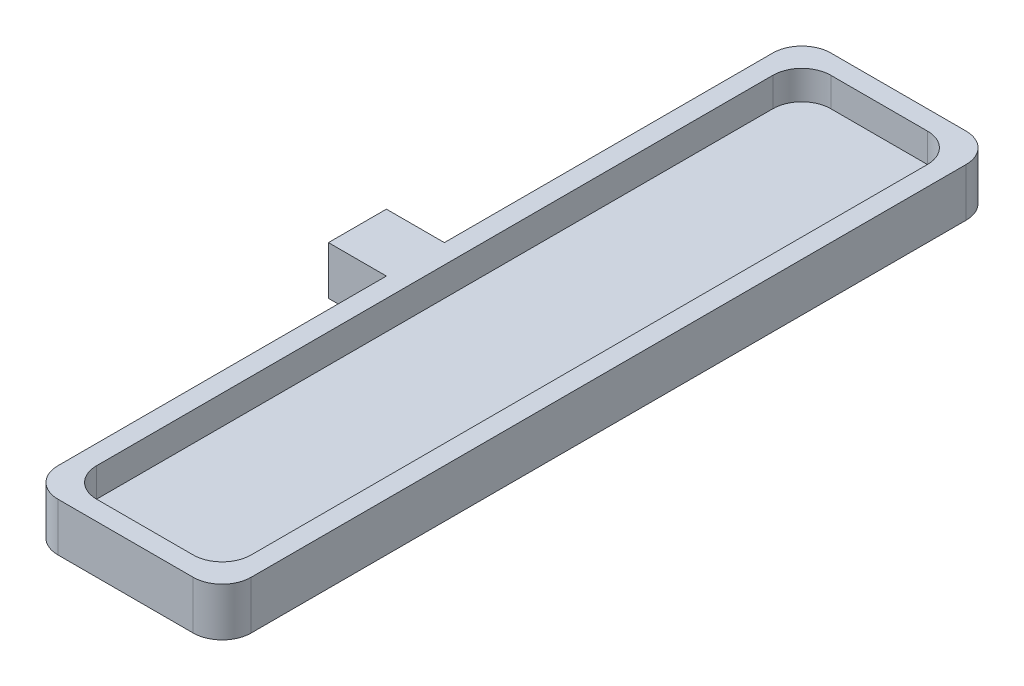
ISO-10303-21;
HEADER;
FILE_DESCRIPTION(('STEP AP214'),'2;1');
FILE_NAME('part.step','',(''),(''),'','','');
FILE_SCHEMA(('AUTOMOTIVE_DESIGN { 1 0 10303 214 1 1 1 1 }'));
ENDSEC;
DATA;
#1=APPLICATION_CONTEXT('core data for automotive mechanical design processes');
#2=APPLICATION_PROTOCOL_DEFINITION('international standard','automotive_design',2000,#1);
#3=PRODUCT_CONTEXT('',#1,'mechanical');
#4=PRODUCT('Part','Part','',(#3));
#5=PRODUCT_RELATED_PRODUCT_CATEGORY('part','',(#4));
#6=PRODUCT_DEFINITION_FORMATION('','',#4);
#7=PRODUCT_DEFINITION_CONTEXT('part definition',#1,'design');
#8=PRODUCT_DEFINITION('design','',#6,#7);
#9=PRODUCT_DEFINITION_SHAPE('','',#8);
#10=(LENGTH_UNIT() NAMED_UNIT(*) SI_UNIT(.MILLI.,.METRE.));
#11=(NAMED_UNIT(*) PLANE_ANGLE_UNIT() SI_UNIT($,.RADIAN.));
#12=(NAMED_UNIT(*) SI_UNIT($,.STERADIAN.) SOLID_ANGLE_UNIT());
#13=UNCERTAINTY_MEASURE_WITH_UNIT(LENGTH_MEASURE(1.E-05),#10,'distance_accuracy_value','');
#14=(GEOMETRIC_REPRESENTATION_CONTEXT(3) GLOBAL_UNCERTAINTY_ASSIGNED_CONTEXT((#13)) GLOBAL_UNIT_ASSIGNED_CONTEXT((#10,
#11,#12)) REPRESENTATION_CONTEXT('',''));
#15=CARTESIAN_POINT('',(0.,0.,0.));
#16=DIRECTION('',(0.,0.,1.));
#17=DIRECTION('',(1.,0.,0.));
#18=AXIS2_PLACEMENT_3D('',#15,#16,#17);
#19=CARTESIAN_POINT('',(0.,5.,0.));
#20=DIRECTION('',(1.,0.,0.));
#21=DIRECTION('',(0.,0.,-1.));
#22=AXIS2_PLACEMENT_3D('',#19,#20,#21);
#23=PLANE('',#22);
#24=DIRECTION('',(0.,1.,0.));
#25=VECTOR('',#24,1.);
#26=CARTESIAN_POINT('',(0.,0.,-37.));
#27=LINE('',#26,#25);
#28=CARTESIAN_POINT('',(0.,0.,-37.));
#29=VERTEX_POINT('',#28);
#30=CARTESIAN_POINT('',(0.,5.,-37.));
#31=VERTEX_POINT('',#30);
#32=EDGE_CURVE('E203',#29,#31,#27,.T.);
#33=ORIENTED_EDGE('',*,*,#32,.F.);
#34=DIRECTION('',(0.,0.,1.));
#35=VECTOR('',#34,1.);
#36=CARTESIAN_POINT('',(0.,0.,0.));
#37=LINE('',#36,#35);
#38=CARTESIAN_POINT('',(0.,0.,-3.));
#39=VERTEX_POINT('',#38);
#40=EDGE_CURVE('E239',#29,#39,#37,.T.);
#41=ORIENTED_EDGE('',*,*,#40,.T.);
#42=DIRECTION('',(0.,-1.,0.));
#43=VECTOR('',#42,1.);
#44=CARTESIAN_POINT('',(0.,5.,-3.));
#45=LINE('',#44,#43);
#46=CARTESIAN_POINT('',(0.,5.,-3.));
#47=VERTEX_POINT('',#46);
#48=EDGE_CURVE('E290',#39,#47,#45,.F.);
#49=ORIENTED_EDGE('',*,*,#48,.T.);
#50=DIRECTION('',(0.,0.,1.));
#51=VECTOR('',#50,1.);
#52=CARTESIAN_POINT('',(0.,5.,0.));
#53=LINE('',#52,#51);
#54=EDGE_CURVE('E55',#31,#47,#53,.T.);
#55=ORIENTED_EDGE('',*,*,#54,.F.);
#56=EDGE_LOOP('',(#33,#41,#49,#55));
#57=FACE_BOUND('',#56,.T.);
#58=ADVANCED_FACE('F39',(#57),#23,.F.);
#59=DIRECTION('',(0.,-1.,0.));
#60=VECTOR('',#59,1.);
#61=CARTESIAN_POINT('',(0.,0.,-43.));
#62=LINE('',#61,#60);
#63=CARTESIAN_POINT('',(0.,5.,-43.));
#64=VERTEX_POINT('',#63);
#65=CARTESIAN_POINT('',(0.,0.,-43.));
#66=VERTEX_POINT('',#65);
#67=EDGE_CURVE('E63',#64,#66,#62,.T.);
#68=ORIENTED_EDGE('',*,*,#67,.F.);
#69=CARTESIAN_POINT('',(0.,5.,-77.));
#70=VERTEX_POINT('',#69);
#71=EDGE_CURVE('E240',#70,#64,#53,.T.);
#72=ORIENTED_EDGE('',*,*,#71,.F.);
#73=DIRECTION('',(0.,-1.,0.));
#74=VECTOR('',#73,1.);
#75=CARTESIAN_POINT('',(0.,5.,-77.));
#76=LINE('',#75,#74);
#77=CARTESIAN_POINT('',(0.,0.,-77.));
#78=VERTEX_POINT('',#77);
#79=EDGE_CURVE('E309',#70,#78,#76,.T.);
#80=ORIENTED_EDGE('',*,*,#79,.T.);
#81=EDGE_CURVE('E254',#78,#66,#37,.T.);
#82=ORIENTED_EDGE('',*,*,#81,.T.);
#83=EDGE_LOOP('',(#68,#72,#80,#82));
#84=FACE_BOUND('',#83,.T.);
#85=ADVANCED_FACE('F416',(#84),#23,.F.);
#86=CARTESIAN_POINT('',(0.,5.,0.));
#87=DIRECTION('',(0.,-1.,0.));
#88=DIRECTION('',(0.,0.,-1.));
#89=AXIS2_PLACEMENT_3D('',#86,#87,#88);
#90=PLANE('',#89);
#91=DIRECTION('',(-1.,0.,0.));
#92=VECTOR('',#91,1.);
#93=CARTESIAN_POINT('',(0.,5.,-80.));
#94=LINE('',#93,#92);
#95=CARTESIAN_POINT('',(17.,5.,-80.));
#96=VERTEX_POINT('',#95);
#97=CARTESIAN_POINT('',(3.,5.,-80.));
#98=VERTEX_POINT('',#97);
#99=EDGE_CURVE('E250',#96,#98,#94,.T.);
#100=ORIENTED_EDGE('',*,*,#99,.T.);
#101=CARTESIAN_POINT('',(3.,5.,-77.));
#102=DIRECTION('',(0.,-1.,0.));
#103=DIRECTION('',(0.,0.,-1.));
#104=AXIS2_PLACEMENT_3D('',#101,#102,#103);
#105=CIRCLE('',#104,3.);
#106=EDGE_CURVE('E319',#98,#70,#105,.F.);
#107=ORIENTED_EDGE('',*,*,#106,.T.);
#108=ORIENTED_EDGE('',*,*,#71,.T.);
#109=DIRECTION('',(1.,0.,0.));
#110=VECTOR('',#109,1.);
#111=CARTESIAN_POINT('',(-6.,5.,-43.));
#112=LINE('',#111,#110);
#113=CARTESIAN_POINT('',(-6.,5.,-43.));
#114=VERTEX_POINT('',#113);
#115=EDGE_CURVE('E186',#114,#64,#112,.T.);
#116=ORIENTED_EDGE('',*,*,#115,.F.);
#117=DIRECTION('',(0.,0.,-1.));
#118=VECTOR('',#117,1.);
#119=CARTESIAN_POINT('',(-6.,5.,-43.));
#120=LINE('',#119,#118);
#121=CARTESIAN_POINT('',(-6.,5.,-37.));
#122=VERTEX_POINT('',#121);
#123=EDGE_CURVE('E177',#122,#114,#120,.T.);
#124=ORIENTED_EDGE('',*,*,#123,.F.);
#125=DIRECTION('',(1.,0.,0.));
#126=VECTOR('',#125,1.);
#127=CARTESIAN_POINT('',(-6.,5.,-37.));
#128=LINE('',#127,#126);
#129=EDGE_CURVE('E183',#122,#31,#128,.T.);
#130=ORIENTED_EDGE('',*,*,#129,.T.);
#131=ORIENTED_EDGE('',*,*,#54,.T.);
#132=CARTESIAN_POINT('',(3.,5.,-3.));
#133=DIRECTION('',(0.,-1.,0.));
#134=DIRECTION('',(0.,0.,-1.));
#135=AXIS2_PLACEMENT_3D('',#132,#133,#134);
#136=CIRCLE('',#135,3.);
#137=CARTESIAN_POINT('',(3.,5.,0.));
#138=VERTEX_POINT('',#137);
#139=EDGE_CURVE('E293',#47,#138,#136,.F.);
#140=ORIENTED_EDGE('',*,*,#139,.T.);
#141=DIRECTION('',(1.,0.,0.));
#142=VECTOR('',#141,1.);
#143=CARTESIAN_POINT('',(0.,5.,0.));
#144=LINE('',#143,#142);
#145=CARTESIAN_POINT('',(17.,5.,0.));
#146=VERTEX_POINT('',#145);
#147=EDGE_CURVE('E243',#138,#146,#144,.T.);
#148=ORIENTED_EDGE('',*,*,#147,.T.);
#149=CARTESIAN_POINT('',(17.,5.,-3.));
#150=DIRECTION('',(0.,-1.,0.));
#151=DIRECTION('',(0.,0.,-1.));
#152=AXIS2_PLACEMENT_3D('',#149,#150,#151);
#153=CIRCLE('',#152,3.);
#154=CARTESIAN_POINT('',(20.,5.,-3.));
#155=VERTEX_POINT('',#154);
#156=EDGE_CURVE('E279',#146,#155,#153,.F.);
#157=ORIENTED_EDGE('',*,*,#156,.T.);
#158=DIRECTION('',(0.,0.,-1.));
#159=VECTOR('',#158,1.);
#160=CARTESIAN_POINT('',(20.,5.,0.));
#161=LINE('',#160,#159);
#162=CARTESIAN_POINT('',(20.,5.,-77.));
#163=VERTEX_POINT('',#162);
#164=EDGE_CURVE('E246',#155,#163,#161,.T.);
#165=ORIENTED_EDGE('',*,*,#164,.T.);
#166=CARTESIAN_POINT('',(17.,5.,-77.));
#167=DIRECTION('',(0.,-1.,0.));
#168=DIRECTION('',(0.,0.,-1.));
#169=AXIS2_PLACEMENT_3D('',#166,#167,#168);
#170=CIRCLE('',#169,3.);
#171=EDGE_CURVE('E306',#163,#96,#170,.F.);
#172=ORIENTED_EDGE('',*,*,#171,.T.);
#173=EDGE_LOOP('',(#100,#107,#108,#116,#124,#130,#131,#140,#148,#157,#165,#172));
#174=FACE_BOUND('',#173,.T.);
#175=DIRECTION('',(0.,0.,1.));
#176=VECTOR('',#175,1.);
#177=CARTESIAN_POINT('',(2.,5.,0.));
#178=LINE('',#177,#176);
#179=CARTESIAN_POINT('',(2.,5.,-75.));
#180=VERTEX_POINT('',#179);
#181=CARTESIAN_POINT('',(2.,5.,-5.));
#182=VERTEX_POINT('',#181);
#183=EDGE_CURVE('E225',#180,#182,#178,.T.);
#184=ORIENTED_EDGE('',*,*,#183,.F.);
#185=CARTESIAN_POINT('',(5.,5.,-75.));
#186=DIRECTION('',(0.,-1.,0.));
#187=DIRECTION('',(0.,0.,-1.));
#188=AXIS2_PLACEMENT_3D('',#185,#186,#187);
#189=CIRCLE('',#188,3.);
#190=CARTESIAN_POINT('',(5.,5.,-78.));
#191=VERTEX_POINT('',#190);
#192=EDGE_CURVE('E359',#180,#191,#189,.T.);
#193=ORIENTED_EDGE('',*,*,#192,.T.);
#194=DIRECTION('',(-1.,0.,0.));
#195=VECTOR('',#194,1.);
#196=CARTESIAN_POINT('',(0.,5.,-78.));
#197=LINE('',#196,#195);
#198=CARTESIAN_POINT('',(15.,5.,-78.));
#199=VERTEX_POINT('',#198);
#200=EDGE_CURVE('E236',#199,#191,#197,.T.);
#201=ORIENTED_EDGE('',*,*,#200,.F.);
#202=CARTESIAN_POINT('',(15.,5.,-75.));
#203=DIRECTION('',(0.,-1.,0.));
#204=DIRECTION('',(0.,0.,-1.));
#205=AXIS2_PLACEMENT_3D('',#202,#203,#204);
#206=CIRCLE('',#205,3.);
#207=CARTESIAN_POINT('',(18.,5.,-75.));
#208=VERTEX_POINT('',#207);
#209=EDGE_CURVE('E11',#199,#208,#206,.T.);
#210=ORIENTED_EDGE('',*,*,#209,.T.);
#211=DIRECTION('',(0.,0.,-1.));
#212=VECTOR('',#211,1.);
#213=CARTESIAN_POINT('',(18.,5.,0.));
#214=LINE('',#213,#212);
#215=CARTESIAN_POINT('',(18.,5.,-5.));
#216=VERTEX_POINT('',#215);
#217=EDGE_CURVE('E232',#216,#208,#214,.T.);
#218=ORIENTED_EDGE('',*,*,#217,.F.);
#219=CARTESIAN_POINT('',(15.,5.,-5.));
#220=DIRECTION('',(0.,-1.,0.));
#221=DIRECTION('',(0.,0.,-1.));
#222=AXIS2_PLACEMENT_3D('',#219,#220,#221);
#223=CIRCLE('',#222,3.);
#224=CARTESIAN_POINT('',(15.,5.,-2.));
#225=VERTEX_POINT('',#224);
#226=EDGE_CURVE('E346',#216,#225,#223,.T.);
#227=ORIENTED_EDGE('',*,*,#226,.T.);
#228=DIRECTION('',(1.,0.,0.));
#229=VECTOR('',#228,1.);
#230=CARTESIAN_POINT('',(0.,5.,-2.));
#231=LINE('',#230,#229);
#232=CARTESIAN_POINT('',(5.,5.,-2.));
#233=VERTEX_POINT('',#232);
#234=EDGE_CURVE('E228',#233,#225,#231,.T.);
#235=ORIENTED_EDGE('',*,*,#234,.F.);
#236=CARTESIAN_POINT('',(5.,5.,-5.));
#237=DIRECTION('',(0.,-1.,0.));
#238=DIRECTION('',(0.,0.,-1.));
#239=AXIS2_PLACEMENT_3D('',#236,#237,#238);
#240=CIRCLE('',#239,3.);
#241=EDGE_CURVE('E332',#233,#182,#240,.T.);
#242=ORIENTED_EDGE('',*,*,#241,.T.);
#243=EDGE_LOOP('',(#184,#193,#201,#210,#218,#227,#235,#242));
#244=FACE_BOUND('',#243,.T.);
#245=ADVANCED_FACE('F180',(#174,#244),#90,.F.);
#246=CARTESIAN_POINT('',(0.,5.,0.));
#247=DIRECTION('',(0.,0.,-1.));
#248=DIRECTION('',(-1.,0.,0.));
#249=AXIS2_PLACEMENT_3D('',#246,#247,#248);
#250=PLANE('',#249);
#251=ORIENTED_EDGE('',*,*,#147,.F.);
#252=DIRECTION('',(0.,-1.,0.));
#253=VECTOR('',#252,1.);
#254=CARTESIAN_POINT('',(3.,5.,0.));
#255=LINE('',#254,#253);
#256=CARTESIAN_POINT('',(3.,0.,0.));
#257=VERTEX_POINT('',#256);
#258=EDGE_CURVE('E282',#138,#257,#255,.T.);
#259=ORIENTED_EDGE('',*,*,#258,.T.);
#260=DIRECTION('',(1.,0.,0.));
#261=VECTOR('',#260,1.);
#262=CARTESIAN_POINT('',(0.,0.,0.));
#263=LINE('',#262,#261);
#264=CARTESIAN_POINT('',(17.,0.,0.));
#265=VERTEX_POINT('',#264);
#266=EDGE_CURVE('E257',#257,#265,#263,.T.);
#267=ORIENTED_EDGE('',*,*,#266,.T.);
#268=DIRECTION('',(0.,-1.,0.));
#269=VECTOR('',#268,1.);
#270=CARTESIAN_POINT('',(17.,5.,0.));
#271=LINE('',#270,#269);
#272=EDGE_CURVE('E275',#265,#146,#271,.F.);
#273=ORIENTED_EDGE('',*,*,#272,.T.);
#274=EDGE_LOOP('',(#251,#259,#267,#273));
#275=FACE_BOUND('',#274,.T.);
#276=ADVANCED_FACE('F423',(#275),#250,.F.);
#277=CARTESIAN_POINT('',(20.,5.,0.));
#278=DIRECTION('',(-1.,0.,0.));
#279=DIRECTION('',(0.,0.,1.));
#280=AXIS2_PLACEMENT_3D('',#277,#278,#279);
#281=PLANE('',#280);
#282=DIRECTION('',(0.,0.,-1.));
#283=VECTOR('',#282,1.);
#284=CARTESIAN_POINT('',(20.,0.,0.));
#285=LINE('',#284,#283);
#286=CARTESIAN_POINT('',(20.,0.,-3.));
#287=VERTEX_POINT('',#286);
#288=CARTESIAN_POINT('',(20.,0.,-77.));
#289=VERTEX_POINT('',#288);
#290=EDGE_CURVE('E260',#287,#289,#285,.T.);
#291=ORIENTED_EDGE('',*,*,#290,.T.);
#292=DIRECTION('',(0.,-1.,0.));
#293=VECTOR('',#292,1.);
#294=CARTESIAN_POINT('',(20.,5.,-77.));
#295=LINE('',#294,#293);
#296=EDGE_CURVE('E303',#289,#163,#295,.F.);
#297=ORIENTED_EDGE('',*,*,#296,.T.);
#298=ORIENTED_EDGE('',*,*,#164,.F.);
#299=DIRECTION('',(0.,-1.,0.));
#300=VECTOR('',#299,1.);
#301=CARTESIAN_POINT('',(20.,5.,-3.));
#302=LINE('',#301,#300);
#303=EDGE_CURVE('E253',#155,#287,#302,.T.);
#304=ORIENTED_EDGE('',*,*,#303,.T.);
#305=EDGE_LOOP('',(#291,#297,#298,#304));
#306=FACE_BOUND('',#305,.T.);
#307=ADVANCED_FACE('F584',(#306),#281,.F.);
#308=CARTESIAN_POINT('',(0.,5.,-80.));
#309=DIRECTION('',(0.,0.,1.));
#310=DIRECTION('',(1.,0.,0.));
#311=AXIS2_PLACEMENT_3D('',#308,#309,#310);
#312=PLANE('',#311);
#313=DIRECTION('',(-1.,0.,0.));
#314=VECTOR('',#313,1.);
#315=CARTESIAN_POINT('',(0.,0.,-80.));
#316=LINE('',#315,#314);
#317=CARTESIAN_POINT('',(17.,0.,-80.));
#318=VERTEX_POINT('',#317);
#319=CARTESIAN_POINT('',(3.,0.,-80.));
#320=VERTEX_POINT('',#319);
#321=EDGE_CURVE('E264',#318,#320,#316,.T.);
#322=ORIENTED_EDGE('',*,*,#321,.T.);
#323=DIRECTION('',(0.,-1.,0.));
#324=VECTOR('',#323,1.);
#325=CARTESIAN_POINT('',(3.,5.,-80.));
#326=LINE('',#325,#324);
#327=EDGE_CURVE('E316',#320,#98,#326,.F.);
#328=ORIENTED_EDGE('',*,*,#327,.T.);
#329=ORIENTED_EDGE('',*,*,#99,.F.);
#330=DIRECTION('',(0.,-1.,0.));
#331=VECTOR('',#330,1.);
#332=CARTESIAN_POINT('',(17.,5.,-80.));
#333=LINE('',#332,#331);
#334=EDGE_CURVE('E296',#96,#318,#333,.T.);
#335=ORIENTED_EDGE('',*,*,#334,.T.);
#336=EDGE_LOOP('',(#322,#328,#329,#335));
#337=FACE_BOUND('',#336,.T.);
#338=ADVANCED_FACE('F528',(#337),#312,.F.);
#339=CARTESIAN_POINT('',(0.,0.,0.));
#340=DIRECTION('',(0.,-1.,0.));
#341=DIRECTION('',(0.,0.,-1.));
#342=AXIS2_PLACEMENT_3D('',#339,#340,#341);
#343=PLANE('',#342);
#344=ORIENTED_EDGE('',*,*,#81,.F.);
#345=CARTESIAN_POINT('',(3.,0.,-77.));
#346=DIRECTION('',(0.,-1.,0.));
#347=DIRECTION('',(0.,0.,-1.));
#348=AXIS2_PLACEMENT_3D('',#345,#346,#347);
#349=CIRCLE('',#348,3.);
#350=EDGE_CURVE('E313',#78,#320,#349,.T.);
#351=ORIENTED_EDGE('',*,*,#350,.T.);
#352=ORIENTED_EDGE('',*,*,#321,.F.);
#353=CARTESIAN_POINT('',(17.,0.,-77.));
#354=DIRECTION('',(0.,-1.,0.));
#355=DIRECTION('',(0.,0.,-1.));
#356=AXIS2_PLACEMENT_3D('',#353,#354,#355);
#357=CIRCLE('',#356,3.);
#358=EDGE_CURVE('E300',#318,#289,#357,.T.);
#359=ORIENTED_EDGE('',*,*,#358,.T.);
#360=ORIENTED_EDGE('',*,*,#290,.F.);
#361=CARTESIAN_POINT('',(17.,0.,-3.));
#362=DIRECTION('',(0.,-1.,0.));
#363=DIRECTION('',(0.,0.,-1.));
#364=AXIS2_PLACEMENT_3D('',#361,#362,#363);
#365=CIRCLE('',#364,3.);
#366=EDGE_CURVE('E271',#287,#265,#365,.T.);
#367=ORIENTED_EDGE('',*,*,#366,.T.);
#368=ORIENTED_EDGE('',*,*,#266,.F.);
#369=CARTESIAN_POINT('',(3.,0.,-3.));
#370=DIRECTION('',(0.,-1.,0.));
#371=DIRECTION('',(0.,0.,-1.));
#372=AXIS2_PLACEMENT_3D('',#369,#370,#371);
#373=CIRCLE('',#372,3.);
#374=EDGE_CURVE('E286',#257,#39,#373,.T.);
#375=ORIENTED_EDGE('',*,*,#374,.T.);
#376=ORIENTED_EDGE('',*,*,#40,.F.);
#377=DIRECTION('',(1.,0.,0.));
#378=VECTOR('',#377,1.);
#379=CARTESIAN_POINT('',(-6.,0.,-37.));
#380=LINE('',#379,#378);
#381=CARTESIAN_POINT('',(-6.,0.,-37.));
#382=VERTEX_POINT('',#381);
#383=EDGE_CURVE('E606',#382,#29,#380,.T.);
#384=ORIENTED_EDGE('',*,*,#383,.F.);
#385=DIRECTION('',(0.,0.,1.));
#386=VECTOR('',#385,1.);
#387=CARTESIAN_POINT('',(-6.,0.,-43.));
#388=LINE('',#387,#386);
#389=CARTESIAN_POINT('',(-6.,0.,-43.));
#390=VERTEX_POINT('',#389);
#391=EDGE_CURVE('E196',#390,#382,#388,.T.);
#392=ORIENTED_EDGE('',*,*,#391,.F.);
#393=DIRECTION('',(1.,0.,0.));
#394=VECTOR('',#393,1.);
#395=CARTESIAN_POINT('',(-6.,0.,-43.));
#396=LINE('',#395,#394);
#397=EDGE_CURVE('E211',#390,#66,#396,.T.);
#398=ORIENTED_EDGE('',*,*,#397,.T.);
#399=EDGE_LOOP('',(#344,#351,#352,#359,#360,#367,#368,#375,#376,#384,#392,#398));
#400=FACE_BOUND('',#399,.T.);
#401=ADVANCED_FACE('F463',(#400),#343,.T.);
#402=CARTESIAN_POINT('',(2.,5.,0.));
#403=DIRECTION('',(1.,0.,0.));
#404=DIRECTION('',(0.,0.,-1.));
#405=AXIS2_PLACEMENT_3D('',#402,#403,#404);
#406=PLANE('',#405);
#407=DIRECTION('',(0.,0.,1.));
#408=VECTOR('',#407,1.);
#409=CARTESIAN_POINT('',(2.,2.,0.));
#410=LINE('',#409,#408);
#411=CARTESIAN_POINT('',(2.,2.,-75.));
#412=VERTEX_POINT('',#411);
#413=CARTESIAN_POINT('',(2.,2.,-5.));
#414=VERTEX_POINT('',#413);
#415=EDGE_CURVE('E205',#412,#414,#410,.T.);
#416=ORIENTED_EDGE('',*,*,#415,.F.);
#417=DIRECTION('',(0.,-1.,0.));
#418=VECTOR('',#417,1.);
#419=CARTESIAN_POINT('',(2.,5.,-75.));
#420=LINE('',#419,#418);
#421=EDGE_CURVE('E356',#412,#180,#420,.F.);
#422=ORIENTED_EDGE('',*,*,#421,.T.);
#423=ORIENTED_EDGE('',*,*,#183,.T.);
#424=DIRECTION('',(0.,-1.,0.));
#425=VECTOR('',#424,1.);
#426=CARTESIAN_POINT('',(2.,2.,-5.));
#427=LINE('',#426,#425);
#428=EDGE_CURVE('E322',#182,#414,#427,.T.);
#429=ORIENTED_EDGE('',*,*,#428,.T.);
#430=EDGE_LOOP('',(#416,#422,#423,#429));
#431=FACE_BOUND('',#430,.T.);
#432=ADVANCED_FACE('F404',(#431),#406,.T.);
#433=CARTESIAN_POINT('',(0.,5.,-2.));
#434=DIRECTION('',(0.,0.,-1.));
#435=DIRECTION('',(-1.,0.,0.));
#436=AXIS2_PLACEMENT_3D('',#433,#434,#435);
#437=PLANE('',#436);
#438=ORIENTED_EDGE('',*,*,#234,.T.);
#439=DIRECTION('',(0.,-1.,0.));
#440=VECTOR('',#439,1.);
#441=CARTESIAN_POINT('',(15.,2.,-2.));
#442=LINE('',#441,#440);
#443=CARTESIAN_POINT('',(15.,2.,-2.));
#444=VERTEX_POINT('',#443);
#445=EDGE_CURVE('E336',#225,#444,#442,.T.);
#446=ORIENTED_EDGE('',*,*,#445,.T.);
#447=DIRECTION('',(1.,0.,0.));
#448=VECTOR('',#447,1.);
#449=CARTESIAN_POINT('',(0.,2.,-2.));
#450=LINE('',#449,#448);
#451=CARTESIAN_POINT('',(5.,2.,-2.));
#452=VERTEX_POINT('',#451);
#453=EDGE_CURVE('E209',#452,#444,#450,.T.);
#454=ORIENTED_EDGE('',*,*,#453,.F.);
#455=DIRECTION('',(0.,-1.,0.));
#456=VECTOR('',#455,1.);
#457=CARTESIAN_POINT('',(5.,5.,-2.));
#458=LINE('',#457,#456);
#459=EDGE_CURVE('E329',#452,#233,#458,.F.);
#460=ORIENTED_EDGE('',*,*,#459,.T.);
#461=EDGE_LOOP('',(#438,#446,#454,#460));
#462=FACE_BOUND('',#461,.T.);
#463=ADVANCED_FACE('F394',(#462),#437,.T.);
#464=CARTESIAN_POINT('',(18.,5.,0.));
#465=DIRECTION('',(-1.,0.,0.));
#466=DIRECTION('',(0.,0.,1.));
#467=AXIS2_PLACEMENT_3D('',#464,#465,#466);
#468=PLANE('',#467);
#469=ORIENTED_EDGE('',*,*,#217,.T.);
#470=DIRECTION('',(0.,-1.,0.));
#471=VECTOR('',#470,1.);
#472=CARTESIAN_POINT('',(18.,2.,-75.));
#473=LINE('',#472,#471);
#474=CARTESIAN_POINT('',(18.,2.,-75.));
#475=VERTEX_POINT('',#474);
#476=EDGE_CURVE('E363',#208,#475,#473,.T.);
#477=ORIENTED_EDGE('',*,*,#476,.T.);
#478=DIRECTION('',(0.,0.,-1.));
#479=VECTOR('',#478,1.);
#480=CARTESIAN_POINT('',(18.,2.,0.));
#481=LINE('',#480,#479);
#482=CARTESIAN_POINT('',(18.,2.,-5.));
#483=VERTEX_POINT('',#482);
#484=EDGE_CURVE('E218',#483,#475,#481,.T.);
#485=ORIENTED_EDGE('',*,*,#484,.F.);
#486=DIRECTION('',(0.,-1.,0.));
#487=VECTOR('',#486,1.);
#488=CARTESIAN_POINT('',(18.,5.,-5.));
#489=LINE('',#488,#487);
#490=EDGE_CURVE('E343',#483,#216,#489,.F.);
#491=ORIENTED_EDGE('',*,*,#490,.T.);
#492=EDGE_LOOP('',(#469,#477,#485,#491));
#493=FACE_BOUND('',#492,.T.);
#494=ADVANCED_FACE('F384',(#493),#468,.T.);
#495=CARTESIAN_POINT('',(0.,5.,-78.));
#496=DIRECTION('',(0.,0.,1.));
#497=DIRECTION('',(1.,0.,0.));
#498=AXIS2_PLACEMENT_3D('',#495,#496,#497);
#499=PLANE('',#498);
#500=DIRECTION('',(-1.,0.,0.));
#501=VECTOR('',#500,1.);
#502=CARTESIAN_POINT('',(0.,2.,-78.));
#503=LINE('',#502,#501);
#504=CARTESIAN_POINT('',(15.,2.,-78.));
#505=VERTEX_POINT('',#504);
#506=CARTESIAN_POINT('',(5.,2.,-78.));
#507=VERTEX_POINT('',#506);
#508=EDGE_CURVE('E222',#505,#507,#503,.T.);
#509=ORIENTED_EDGE('',*,*,#508,.F.);
#510=DIRECTION('',(0.,-1.,0.));
#511=VECTOR('',#510,1.);
#512=CARTESIAN_POINT('',(15.,5.,-78.));
#513=LINE('',#512,#511);
#514=EDGE_CURVE('E48',#505,#199,#513,.F.);
#515=ORIENTED_EDGE('',*,*,#514,.T.);
#516=ORIENTED_EDGE('',*,*,#200,.T.);
#517=DIRECTION('',(0.,-1.,0.));
#518=VECTOR('',#517,1.);
#519=CARTESIAN_POINT('',(5.,2.,-78.));
#520=LINE('',#519,#518);
#521=EDGE_CURVE('E349',#191,#507,#520,.T.);
#522=ORIENTED_EDGE('',*,*,#521,.T.);
#523=EDGE_LOOP('',(#509,#515,#516,#522));
#524=FACE_BOUND('',#523,.T.);
#525=ADVANCED_FACE('F374',(#524),#499,.T.);
#526=CARTESIAN_POINT('',(0.,2.,0.));
#527=DIRECTION('',(0.,-1.,0.));
#528=DIRECTION('',(0.,0.,-1.));
#529=AXIS2_PLACEMENT_3D('',#526,#527,#528);
#530=PLANE('',#529);
#531=ORIENTED_EDGE('',*,*,#484,.T.);
#532=CARTESIAN_POINT('',(15.,2.,-75.));
#533=DIRECTION('',(0.,-1.,0.));
#534=DIRECTION('',(0.,0.,-1.));
#535=AXIS2_PLACEMENT_3D('',#532,#533,#534);
#536=CIRCLE('',#535,3.);
#537=EDGE_CURVE('E367',#475,#505,#536,.F.);
#538=ORIENTED_EDGE('',*,*,#537,.T.);
#539=ORIENTED_EDGE('',*,*,#508,.T.);
#540=CARTESIAN_POINT('',(5.,2.,-75.));
#541=DIRECTION('',(0.,-1.,0.));
#542=DIRECTION('',(0.,0.,-1.));
#543=AXIS2_PLACEMENT_3D('',#540,#541,#542);
#544=CIRCLE('',#543,3.);
#545=EDGE_CURVE('E353',#507,#412,#544,.F.);
#546=ORIENTED_EDGE('',*,*,#545,.T.);
#547=ORIENTED_EDGE('',*,*,#415,.T.);
#548=CARTESIAN_POINT('',(5.,2.,-5.));
#549=DIRECTION('',(0.,-1.,0.));
#550=DIRECTION('',(0.,0.,-1.));
#551=AXIS2_PLACEMENT_3D('',#548,#549,#550);
#552=CIRCLE('',#551,3.);
#553=EDGE_CURVE('E326',#414,#452,#552,.F.);
#554=ORIENTED_EDGE('',*,*,#553,.T.);
#555=ORIENTED_EDGE('',*,*,#453,.T.);
#556=CARTESIAN_POINT('',(15.,2.,-5.));
#557=DIRECTION('',(0.,-1.,0.));
#558=DIRECTION('',(0.,0.,-1.));
#559=AXIS2_PLACEMENT_3D('',#556,#557,#558);
#560=CIRCLE('',#559,3.);
#561=EDGE_CURVE('E340',#444,#483,#560,.F.);
#562=ORIENTED_EDGE('',*,*,#561,.T.);
#563=EDGE_LOOP('',(#531,#538,#539,#546,#547,#554,#555,#562));
#564=FACE_BOUND('',#563,.T.);
#565=ADVANCED_FACE('F387',(#564),#530,.F.);
#566=CARTESIAN_POINT('',(17.,5.,-3.));
#567=DIRECTION('',(0.,-1.,0.));
#568=DIRECTION('',(0.,0.,-1.));
#569=AXIS2_PLACEMENT_3D('',#566,#567,#568);
#570=CYLINDRICAL_SURFACE('',#569,3.);
#571=ORIENTED_EDGE('',*,*,#156,.F.);
#572=ORIENTED_EDGE('',*,*,#272,.F.);
#573=ORIENTED_EDGE('',*,*,#366,.F.);
#574=ORIENTED_EDGE('',*,*,#303,.F.);
#575=EDGE_LOOP('',(#571,#572,#573,#574));
#576=FACE_BOUND('',#575,.T.);
#577=ADVANCED_FACE('F425',(#576),#570,.T.);
#578=CARTESIAN_POINT('',(3.,5.,-3.));
#579=DIRECTION('',(0.,-1.,0.));
#580=DIRECTION('',(0.,0.,-1.));
#581=AXIS2_PLACEMENT_3D('',#578,#579,#580);
#582=CYLINDRICAL_SURFACE('',#581,3.);
#583=ORIENTED_EDGE('',*,*,#139,.F.);
#584=ORIENTED_EDGE('',*,*,#48,.F.);
#585=ORIENTED_EDGE('',*,*,#374,.F.);
#586=ORIENTED_EDGE('',*,*,#258,.F.);
#587=EDGE_LOOP('',(#583,#584,#585,#586));
#588=FACE_BOUND('',#587,.T.);
#589=ADVANCED_FACE('F428',(#588),#582,.T.);
#590=CARTESIAN_POINT('',(17.,5.,-77.));
#591=DIRECTION('',(0.,-1.,0.));
#592=DIRECTION('',(0.,0.,-1.));
#593=AXIS2_PLACEMENT_3D('',#590,#591,#592);
#594=CYLINDRICAL_SURFACE('',#593,3.);
#595=ORIENTED_EDGE('',*,*,#171,.F.);
#596=ORIENTED_EDGE('',*,*,#296,.F.);
#597=ORIENTED_EDGE('',*,*,#358,.F.);
#598=ORIENTED_EDGE('',*,*,#334,.F.);
#599=EDGE_LOOP('',(#595,#596,#597,#598));
#600=FACE_BOUND('',#599,.T.);
#601=ADVANCED_FACE('F432',(#600),#594,.T.);
#602=CARTESIAN_POINT('',(3.,5.,-77.));
#603=DIRECTION('',(0.,-1.,0.));
#604=DIRECTION('',(0.,0.,-1.));
#605=AXIS2_PLACEMENT_3D('',#602,#603,#604);
#606=CYLINDRICAL_SURFACE('',#605,3.);
#607=ORIENTED_EDGE('',*,*,#106,.F.);
#608=ORIENTED_EDGE('',*,*,#327,.F.);
#609=ORIENTED_EDGE('',*,*,#350,.F.);
#610=ORIENTED_EDGE('',*,*,#79,.F.);
#611=EDGE_LOOP('',(#607,#608,#609,#610));
#612=FACE_BOUND('',#611,.T.);
#613=ADVANCED_FACE('F436',(#612),#606,.T.);
#614=CARTESIAN_POINT('',(5.,5.,-5.));
#615=DIRECTION('',(0.,1.,0.));
#616=DIRECTION('',(0.,0.,1.));
#617=AXIS2_PLACEMENT_3D('',#614,#615,#616);
#618=CYLINDRICAL_SURFACE('',#617,3.);
#619=ORIENTED_EDGE('',*,*,#241,.F.);
#620=ORIENTED_EDGE('',*,*,#459,.F.);
#621=ORIENTED_EDGE('',*,*,#553,.F.);
#622=ORIENTED_EDGE('',*,*,#428,.F.);
#623=EDGE_LOOP('',(#619,#620,#621,#622));
#624=FACE_BOUND('',#623,.T.);
#625=ADVANCED_FACE('F400',(#624),#618,.F.);
#626=CARTESIAN_POINT('',(15.,5.,-5.));
#627=DIRECTION('',(0.,1.,0.));
#628=DIRECTION('',(0.,0.,1.));
#629=AXIS2_PLACEMENT_3D('',#626,#627,#628);
#630=CYLINDRICAL_SURFACE('',#629,3.);
#631=ORIENTED_EDGE('',*,*,#226,.F.);
#632=ORIENTED_EDGE('',*,*,#490,.F.);
#633=ORIENTED_EDGE('',*,*,#561,.F.);
#634=ORIENTED_EDGE('',*,*,#445,.F.);
#635=EDGE_LOOP('',(#631,#632,#633,#634));
#636=FACE_BOUND('',#635,.T.);
#637=ADVANCED_FACE('F392',(#636),#630,.F.);
#638=CARTESIAN_POINT('',(5.,5.,-75.));
#639=DIRECTION('',(0.,1.,0.));
#640=DIRECTION('',(0.,0.,1.));
#641=AXIS2_PLACEMENT_3D('',#638,#639,#640);
#642=CYLINDRICAL_SURFACE('',#641,3.);
#643=ORIENTED_EDGE('',*,*,#192,.F.);
#644=ORIENTED_EDGE('',*,*,#421,.F.);
#645=ORIENTED_EDGE('',*,*,#545,.F.);
#646=ORIENTED_EDGE('',*,*,#521,.F.);
#647=EDGE_LOOP('',(#643,#644,#645,#646));
#648=FACE_BOUND('',#647,.T.);
#649=ADVANCED_FACE('F407',(#648),#642,.F.);
#650=CARTESIAN_POINT('',(15.,5.,-75.));
#651=DIRECTION('',(0.,1.,0.));
#652=DIRECTION('',(0.,0.,1.));
#653=AXIS2_PLACEMENT_3D('',#650,#651,#652);
#654=CYLINDRICAL_SURFACE('',#653,3.);
#655=ORIENTED_EDGE('',*,*,#209,.F.);
#656=ORIENTED_EDGE('',*,*,#514,.F.);
#657=ORIENTED_EDGE('',*,*,#537,.F.);
#658=ORIENTED_EDGE('',*,*,#476,.F.);
#659=EDGE_LOOP('',(#655,#656,#657,#658));
#660=FACE_BOUND('',#659,.T.);
#661=ADVANCED_FACE('F41',(#660),#654,.F.);
#662=CARTESIAN_POINT('',(-6.,0.,-37.));
#663=DIRECTION('',(0.,0.,-1.));
#664=DIRECTION('',(-1.,0.,0.));
#665=AXIS2_PLACEMENT_3D('',#662,#663,#664);
#666=PLANE('',#665);
#667=ORIENTED_EDGE('',*,*,#32,.T.);
#668=ORIENTED_EDGE('',*,*,#129,.F.);
#669=DIRECTION('',(0.,1.,0.));
#670=VECTOR('',#669,1.);
#671=CARTESIAN_POINT('',(-6.,0.,-37.));
#672=LINE('',#671,#670);
#673=EDGE_CURVE('E191',#382,#122,#672,.T.);
#674=ORIENTED_EDGE('',*,*,#673,.F.);
#675=ORIENTED_EDGE('',*,*,#383,.T.);
#676=EDGE_LOOP('',(#667,#668,#674,#675));
#677=FACE_BOUND('',#676,.T.);
#678=ADVANCED_FACE('F202',(#677),#666,.F.);
#679=CARTESIAN_POINT('',(-6.,0.,-43.));
#680=DIRECTION('',(0.,0.,1.));
#681=DIRECTION('',(1.,0.,0.));
#682=AXIS2_PLACEMENT_3D('',#679,#680,#681);
#683=PLANE('',#682);
#684=ORIENTED_EDGE('',*,*,#67,.T.);
#685=ORIENTED_EDGE('',*,*,#397,.F.);
#686=DIRECTION('',(0.,-1.,0.));
#687=VECTOR('',#686,1.);
#688=CARTESIAN_POINT('',(-6.,0.,-43.));
#689=LINE('',#688,#687);
#690=EDGE_CURVE('E190',#114,#390,#689,.T.);
#691=ORIENTED_EDGE('',*,*,#690,.F.);
#692=ORIENTED_EDGE('',*,*,#115,.T.);
#693=EDGE_LOOP('',(#684,#685,#691,#692));
#694=FACE_BOUND('',#693,.T.);
#695=ADVANCED_FACE('F539',(#694),#683,.F.);
#696=CARTESIAN_POINT('',(-6.,0.,0.));
#697=DIRECTION('',(1.,0.,0.));
#698=DIRECTION('',(0.,0.,-1.));
#699=AXIS2_PLACEMENT_3D('',#696,#697,#698);
#700=PLANE('',#699);
#701=CARTESIAN_POINT('',(-6.,2.5,-40.));
#702=DIRECTION('',(-1.,0.,0.));
#703=DIRECTION('',(0.,0.,1.));
#704=AXIS2_PLACEMENT_3D('',#701,#702,#703);
#705=CIRCLE('',#704,1.425);
#706=CARTESIAN_POINT('',(-6.,2.5,-38.575));
#707=VERTEX_POINT('',#706);
#708=EDGE_CURVE('E619',#707,#707,#705,.T.);
#709=ORIENTED_EDGE('',*,*,#708,.F.);
#710=EDGE_LOOP('',(#709));
#711=FACE_BOUND('',#710,.T.);
#712=ORIENTED_EDGE('',*,*,#673,.T.);
#713=ORIENTED_EDGE('',*,*,#123,.T.);
#714=ORIENTED_EDGE('',*,*,#690,.T.);
#715=ORIENTED_EDGE('',*,*,#391,.T.);
#716=EDGE_LOOP('',(#712,#713,#714,#715));
#717=FACE_BOUND('',#716,.T.);
#718=ADVANCED_FACE('F194',(#711,#717),#700,.F.);
#719=CARTESIAN_POINT('',(-2.,2.5,-40.));
#720=DIRECTION('',(-1.,0.,0.));
#721=DIRECTION('',(0.,0.,1.));
#722=AXIS2_PLACEMENT_3D('',#719,#720,#721);
#723=CYLINDRICAL_SURFACE('',#722,1.425);
#724=CARTESIAN_POINT('',(-2.,2.5,-40.));
#725=DIRECTION('',(-1.,0.,0.));
#726=DIRECTION('',(0.,0.,1.));
#727=AXIS2_PLACEMENT_3D('',#724,#725,#726);
#728=CIRCLE('',#727,1.425);
#729=CARTESIAN_POINT('',(-2.,2.5,-38.575));
#730=VERTEX_POINT('',#729);
#731=EDGE_CURVE('E614',#730,#730,#728,.T.);
#732=ORIENTED_EDGE('',*,*,#731,.F.);
#733=EDGE_LOOP('',(#732));
#734=FACE_BOUND('',#733,.T.);
#735=ORIENTED_EDGE('',*,*,#708,.T.);
#736=EDGE_LOOP('',(#735));
#737=FACE_BOUND('',#736,.T.);
#738=ADVANCED_FACE('F557',(#734,#737),#723,.F.);
#739=CARTESIAN_POINT('',(-2.,2.5,-40.));
#740=DIRECTION('',(-1.,0.,0.));
#741=DIRECTION('',(0.,0.,1.));
#742=AXIS2_PLACEMENT_3D('',#739,#740,#741);
#743=PLANE('',#742);
#744=ORIENTED_EDGE('',*,*,#731,.T.);
#745=EDGE_LOOP('',(#744));
#746=FACE_BOUND('',#745,.T.);
#747=ADVANCED_FACE('F567',(#746),#743,.T.);
#748=CLOSED_SHELL('',(#58,#85,#245,#276,#307,#338,#401,#432,#463,#494,#525,#565,#577,#589,#601,
#613,#625,#637,#649,#661,#678,#695,#718,#738,#747));
#749=MANIFOLD_SOLID_BREP('B2',#748);
#750=ADVANCED_BREP_SHAPE_REPRESENTATION('',(#18,#749),#14);
#751=SHAPE_DEFINITION_REPRESENTATION(#9,#750);
ENDSEC;
END-ISO-10303-21;
